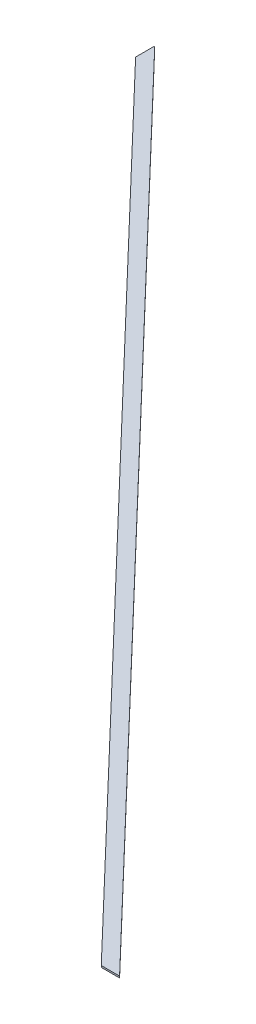
ISO-10303-21;
HEADER;
FILE_DESCRIPTION(('STEP AP214'),'2;1');
FILE_NAME('part.step','',(''),(''),'','','');
FILE_SCHEMA(('AUTOMOTIVE_DESIGN { 1 0 10303 214 1 1 1 1 }'));
ENDSEC;
DATA;
#1=APPLICATION_CONTEXT('core data for automotive mechanical design processes');
#2=APPLICATION_PROTOCOL_DEFINITION('international standard','automotive_design',2000,#1);
#3=PRODUCT_CONTEXT('',#1,'mechanical');
#4=PRODUCT('Part','Part','',(#3));
#5=PRODUCT_RELATED_PRODUCT_CATEGORY('part','',(#4));
#6=PRODUCT_DEFINITION_FORMATION('','',#4);
#7=PRODUCT_DEFINITION_CONTEXT('part definition',#1,'design');
#8=PRODUCT_DEFINITION('design','',#6,#7);
#9=PRODUCT_DEFINITION_SHAPE('','',#8);
#10=(LENGTH_UNIT() NAMED_UNIT(*) SI_UNIT(.MILLI.,.METRE.));
#11=(NAMED_UNIT(*) PLANE_ANGLE_UNIT() SI_UNIT($,.RADIAN.));
#12=(NAMED_UNIT(*) SI_UNIT($,.STERADIAN.) SOLID_ANGLE_UNIT());
#13=UNCERTAINTY_MEASURE_WITH_UNIT(LENGTH_MEASURE(1.E-05),#10,'distance_accuracy_value','');
#14=(GEOMETRIC_REPRESENTATION_CONTEXT(3) GLOBAL_UNCERTAINTY_ASSIGNED_CONTEXT((#13)) GLOBAL_UNIT_ASSIGNED_CONTEXT((#10,
#11,#12)) REPRESENTATION_CONTEXT('',''));
#15=CARTESIAN_POINT('',(0.,0.,0.));
#16=DIRECTION('',(0.,0.,1.));
#17=DIRECTION('',(1.,0.,0.));
#18=AXIS2_PLACEMENT_3D('',#15,#16,#17);
#19=CARTESIAN_POINT('',(-1530.61287724519,6.35,-1562.59287966691));
#20=DIRECTION('',(0.,1.,0.));
#21=DIRECTION('',(0.,0.,1.));
#22=AXIS2_PLACEMENT_3D('',#19,#20,#21);
#23=PLANE('',#22);
#24=DIRECTION('',(0.691513055782269,0.,0.722363962059756));
#25=VECTOR('',#24,1.);
#26=CARTESIAN_POINT('',(-3025.40308827933,6.35,-3086.91519824232));
#27=LINE('',#26,#25);
#28=CARTESIAN_POINT('',(-70.3246599610939,6.35,7.81458231458032E-13));
#29=VERTEX_POINT('',#28);
#30=CARTESIAN_POINT('',(-3025.40308827933,6.35,-3086.91519824232));
#31=VERTEX_POINT('',#30);
#32=EDGE_CURVE('E67',#29,#31,#27,.F.);
#33=ORIENTED_EDGE('',*,*,#32,.F.);
#34=DIRECTION('',(1.,0.,0.));
#35=VECTOR('',#34,1.);
#36=CARTESIAN_POINT('',(-70.3246599610927,6.35,0.));
#37=LINE('',#36,#35);
#38=CARTESIAN_POINT('',(0.,6.35,0.));
#39=VERTEX_POINT('',#38);
#40=EDGE_CURVE('E54',#39,#29,#37,.F.);
#41=ORIENTED_EDGE('',*,*,#40,.F.);
#42=DIRECTION('',(-0.691513055782269,0.,-0.722363962059756));
#43=VECTOR('',#42,1.);
#44=CARTESIAN_POINT('',(0.,6.35,0.));
#45=LINE('',#44,#43);
#46=CARTESIAN_POINT('',(-3025.40308827933,6.35,-3160.3772964272));
#47=VERTEX_POINT('',#46);
#48=EDGE_CURVE('E19',#47,#39,#45,.F.);
#49=ORIENTED_EDGE('',*,*,#48,.F.);
#50=DIRECTION('',(0.,0.,1.));
#51=VECTOR('',#50,1.);
#52=CARTESIAN_POINT('',(-3025.40308827933,6.35,-3160.3772964272));
#53=LINE('',#52,#51);
#54=EDGE_CURVE('E79',#31,#47,#53,.F.);
#55=ORIENTED_EDGE('',*,*,#54,.F.);
#56=EDGE_LOOP('',(#33,#41,#49,#55));
#57=FACE_BOUND('',#56,.T.);
#58=ADVANCED_FACE('F16',(#57),#23,.T.);
#59=CARTESIAN_POINT('',(0.,0.,0.));
#60=DIRECTION('',(0.722363962059756,0.,-0.691513055782269));
#61=DIRECTION('',(-0.691513055782269,0.,-0.722363962059756));
#62=AXIS2_PLACEMENT_3D('',#59,#60,#61);
#63=PLANE('',#62);
#64=ORIENTED_EDGE('',*,*,#48,.T.);
#65=DIRECTION('',(0.,1.,0.));
#66=VECTOR('',#65,1.);
#67=CARTESIAN_POINT('',(0.,0.,0.));
#68=LINE('',#67,#66);
#69=CARTESIAN_POINT('',(3.33066907387547E-13,0.,1.11022302462516E-13));
#70=VERTEX_POINT('',#69);
#71=EDGE_CURVE('E60',#70,#39,#68,.T.);
#72=ORIENTED_EDGE('',*,*,#71,.F.);
#73=DIRECTION('',(0.691513055782269,0.,0.722363962059756));
#74=VECTOR('',#73,1.);
#75=CARTESIAN_POINT('',(-3025.40308827933,0.,-3160.3772964272));
#76=LINE('',#75,#74);
#77=CARTESIAN_POINT('',(-3025.40308827933,0.,-3160.3772964272));
#78=VERTEX_POINT('',#77);
#79=EDGE_CURVE('E82',#78,#70,#76,.T.);
#80=ORIENTED_EDGE('',*,*,#79,.F.);
#81=DIRECTION('',(0.,1.,0.));
#82=VECTOR('',#81,1.);
#83=CARTESIAN_POINT('',(-3025.40308827933,0.,-3160.3772964272));
#84=LINE('',#83,#82);
#85=EDGE_CURVE('E63',#47,#78,#84,.F.);
#86=ORIENTED_EDGE('',*,*,#85,.F.);
#87=EDGE_LOOP('',(#64,#72,#80,#86));
#88=FACE_BOUND('',#87,.T.);
#89=ADVANCED_FACE('F59',(#88),#63,.T.);
#90=CARTESIAN_POINT('',(-70.3246599610927,0.,0.));
#91=DIRECTION('',(0.,0.,1.));
#92=DIRECTION('',(1.,0.,0.));
#93=AXIS2_PLACEMENT_3D('',#90,#91,#92);
#94=PLANE('',#93);
#95=ORIENTED_EDGE('',*,*,#40,.T.);
#96=DIRECTION('',(0.,1.,0.));
#97=VECTOR('',#96,1.);
#98=CARTESIAN_POINT('',(-70.3246599610967,0.,3.5527136788005E-12));
#99=LINE('',#98,#97);
#100=CARTESIAN_POINT('',(-70.3246599610937,0.,9.06345113149435E-13));
#101=VERTEX_POINT('',#100);
#102=EDGE_CURVE('E69',#101,#29,#99,.T.);
#103=ORIENTED_EDGE('',*,*,#102,.F.);
#104=DIRECTION('',(1.,0.,0.));
#105=VECTOR('',#104,1.);
#106=CARTESIAN_POINT('',(-1530.61287724519,0.,0.));
#107=LINE('',#106,#105);
#108=EDGE_CURVE('E73',#70,#101,#107,.F.);
#109=ORIENTED_EDGE('',*,*,#108,.F.);
#110=ORIENTED_EDGE('',*,*,#71,.T.);
#111=EDGE_LOOP('',(#95,#103,#109,#110));
#112=FACE_BOUND('',#111,.T.);
#113=ADVANCED_FACE('F71',(#112),#94,.T.);
#114=CARTESIAN_POINT('',(-3025.40308827933,0.,-3086.91519824232));
#115=DIRECTION('',(-0.722363962059756,0.,0.691513055782269));
#116=DIRECTION('',(0.691513055782269,0.,0.722363962059756));
#117=AXIS2_PLACEMENT_3D('',#114,#115,#116);
#118=PLANE('',#117);
#119=ORIENTED_EDGE('',*,*,#32,.T.);
#120=DIRECTION('',(0.,1.,0.));
#121=VECTOR('',#120,1.);
#122=CARTESIAN_POINT('',(-3025.40308827933,0.,-3086.91519824232));
#123=LINE('',#122,#121);
#124=CARTESIAN_POINT('',(-3025.40308827933,0.,-3086.91519824232));
#125=VERTEX_POINT('',#124);
#126=EDGE_CURVE('E34',#125,#31,#123,.T.);
#127=ORIENTED_EDGE('',*,*,#126,.F.);
#128=DIRECTION('',(-0.69151305578227,0.,-0.722363962059755));
#129=VECTOR('',#128,1.);
#130=CARTESIAN_POINT('',(-70.3246599610927,0.,0.));
#131=LINE('',#130,#129);
#132=EDGE_CURVE('E25',#101,#125,#131,.T.);
#133=ORIENTED_EDGE('',*,*,#132,.F.);
#134=ORIENTED_EDGE('',*,*,#102,.T.);
#135=EDGE_LOOP('',(#119,#127,#133,#134));
#136=FACE_BOUND('',#135,.T.);
#137=ADVANCED_FACE('F88',(#136),#118,.T.);
#138=CARTESIAN_POINT('',(-3025.40308827933,0.,-3160.3772964272));
#139=DIRECTION('',(-1.,0.,0.));
#140=DIRECTION('',(0.,0.,1.));
#141=AXIS2_PLACEMENT_3D('',#138,#139,#140);
#142=PLANE('',#141);
#143=ORIENTED_EDGE('',*,*,#54,.T.);
#144=ORIENTED_EDGE('',*,*,#85,.T.);
#145=DIRECTION('',(0.,0.,-1.));
#146=VECTOR('',#145,1.);
#147=CARTESIAN_POINT('',(-3025.40308827933,0.,-1562.59287966691));
#148=LINE('',#147,#146);
#149=EDGE_CURVE('E11',#125,#78,#148,.T.);
#150=ORIENTED_EDGE('',*,*,#149,.F.);
#151=ORIENTED_EDGE('',*,*,#126,.T.);
#152=EDGE_LOOP('',(#143,#144,#150,#151));
#153=FACE_BOUND('',#152,.T.);
#154=ADVANCED_FACE('F90',(#153),#142,.T.);
#155=CARTESIAN_POINT('',(-1530.61287724519,0.,-1562.59287966691));
#156=DIRECTION('',(0.,-1.,0.));
#157=DIRECTION('',(0.,0.,-1.));
#158=AXIS2_PLACEMENT_3D('',#155,#156,#157);
#159=PLANE('',#158);
#160=ORIENTED_EDGE('',*,*,#132,.T.);
#161=ORIENTED_EDGE('',*,*,#149,.T.);
#162=ORIENTED_EDGE('',*,*,#79,.T.);
#163=ORIENTED_EDGE('',*,*,#108,.T.);
#164=EDGE_LOOP('',(#160,#161,#162,#163));
#165=FACE_BOUND('',#164,.T.);
#166=ADVANCED_FACE('F87',(#165),#159,.T.);
#167=CLOSED_SHELL('',(#58,#89,#113,#137,#154,#166));
#168=MANIFOLD_SOLID_BREP('B1',#167);
#169=ADVANCED_BREP_SHAPE_REPRESENTATION('',(#18,#168),#14);
#170=SHAPE_DEFINITION_REPRESENTATION(#9,#169);
ENDSEC;
END-ISO-10303-21;
